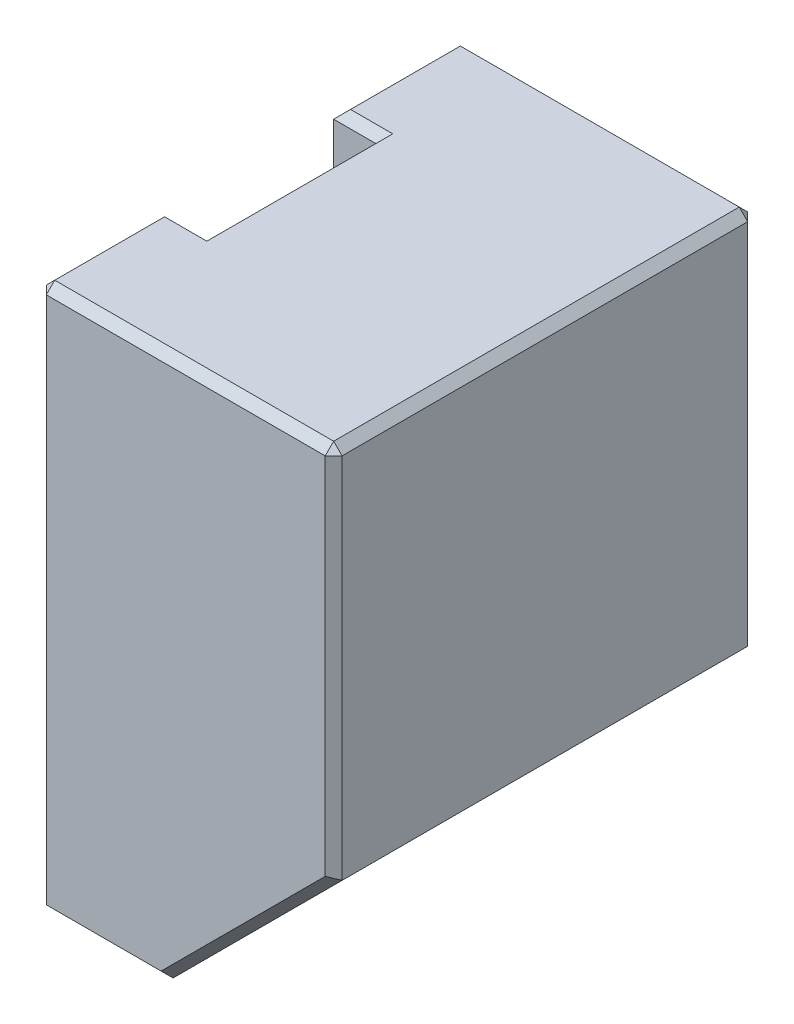
ISO-10303-21;
HEADER;
FILE_DESCRIPTION(('STEP AP214'),'2;1');
FILE_NAME('part.step','',(''),(''),'','','');
FILE_SCHEMA(('AUTOMOTIVE_DESIGN { 1 0 10303 214 1 1 1 1 }'));
ENDSEC;
DATA;
#1=APPLICATION_CONTEXT('core data for automotive mechanical design processes');
#2=APPLICATION_PROTOCOL_DEFINITION('international standard','automotive_design',2000,#1);
#3=PRODUCT_CONTEXT('',#1,'mechanical');
#4=PRODUCT('Part','Part','',(#3));
#5=PRODUCT_RELATED_PRODUCT_CATEGORY('part','',(#4));
#6=PRODUCT_DEFINITION_FORMATION('','',#4);
#7=PRODUCT_DEFINITION_CONTEXT('part definition',#1,'design');
#8=PRODUCT_DEFINITION('design','',#6,#7);
#9=PRODUCT_DEFINITION_SHAPE('','',#8);
#10=(LENGTH_UNIT() NAMED_UNIT(*) SI_UNIT(.MILLI.,.METRE.));
#11=(NAMED_UNIT(*) PLANE_ANGLE_UNIT() SI_UNIT($,.RADIAN.));
#12=(NAMED_UNIT(*) SI_UNIT($,.STERADIAN.) SOLID_ANGLE_UNIT());
#13=UNCERTAINTY_MEASURE_WITH_UNIT(LENGTH_MEASURE(1.E-05),#10,'distance_accuracy_value','');
#14=(GEOMETRIC_REPRESENTATION_CONTEXT(3) GLOBAL_UNCERTAINTY_ASSIGNED_CONTEXT((#13)) GLOBAL_UNIT_ASSIGNED_CONTEXT((#10,
#11,#12)) REPRESENTATION_CONTEXT('',''));
#15=CARTESIAN_POINT('',(0.,0.,0.));
#16=DIRECTION('',(0.,0.,1.));
#17=DIRECTION('',(1.,0.,0.));
#18=AXIS2_PLACEMENT_3D('',#15,#16,#17);
#19=CARTESIAN_POINT('',(-17.5,-40.5,12.5));
#20=DIRECTION('',(-1.,0.,0.));
#21=DIRECTION('',(0.,0.,1.));
#22=AXIS2_PLACEMENT_3D('',#19,#20,#21);
#23=CYLINDRICAL_SURFACE('',#22,2.5);
#24=DIRECTION('',(1.,0.,0.));
#25=VECTOR('',#24,1.);
#26=CARTESIAN_POINT('',(-17.5,-43.,12.5));
#27=LINE('',#26,#25);
#28=CARTESIAN_POINT('',(-17.5,-43.,12.5));
#29=VERTEX_POINT('',#28);
#30=CARTESIAN_POINT('',(-12.5,-43.,12.5));
#31=VERTEX_POINT('',#30);
#32=EDGE_CURVE('E318',#29,#31,#27,.T.);
#33=ORIENTED_EDGE('',*,*,#32,.F.);
#34=CARTESIAN_POINT('',(-17.5,-40.5,12.5));
#35=DIRECTION('',(-1.,0.,0.));
#36=DIRECTION('',(0.,0.,1.));
#37=AXIS2_PLACEMENT_3D('',#34,#35,#36);
#38=CIRCLE('',#37,2.5);
#39=CARTESIAN_POINT('',(-17.5,-38.,12.5));
#40=VERTEX_POINT('',#39);
#41=EDGE_CURVE('E326',#29,#40,#38,.T.);
#42=ORIENTED_EDGE('',*,*,#41,.T.);
#43=DIRECTION('',(1.,0.,0.));
#44=VECTOR('',#43,1.);
#45=CARTESIAN_POINT('',(-17.5,-38.,12.5));
#46=LINE('',#45,#44);
#47=CARTESIAN_POINT('',(-12.5,-38.,12.5));
#48=VERTEX_POINT('',#47);
#49=EDGE_CURVE('E321',#48,#40,#46,.F.);
#50=ORIENTED_EDGE('',*,*,#49,.F.);
#51=CARTESIAN_POINT('',(-12.5,-40.5,12.5));
#52=DIRECTION('',(1.,0.,0.));
#53=DIRECTION('',(0.,0.,-1.));
#54=AXIS2_PLACEMENT_3D('',#51,#52,#53);
#55=CIRCLE('',#54,2.5);
#56=EDGE_CURVE('E324',#31,#48,#55,.F.);
#57=ORIENTED_EDGE('',*,*,#56,.F.);
#58=EDGE_LOOP('',(#33,#42,#50,#57));
#59=FACE_BOUND('',#58,.T.);
#60=ADVANCED_FACE('F47',(#59),#23,.F.);
#61=CARTESIAN_POINT('',(-12.5,-40.5,-12.5));
#62=DIRECTION('',(-1.,0.,0.));
#63=DIRECTION('',(0.,0.,1.));
#64=AXIS2_PLACEMENT_3D('',#61,#62,#63);
#65=CYLINDRICAL_SURFACE('',#64,2.5);
#66=DIRECTION('',(1.,0.,0.));
#67=VECTOR('',#66,1.);
#68=CARTESIAN_POINT('',(-12.5,-43.,-12.5));
#69=LINE('',#68,#67);
#70=CARTESIAN_POINT('',(-12.5,-43.,-12.5));
#71=VERTEX_POINT('',#70);
#72=CARTESIAN_POINT('',(-17.5,-43.,-12.5));
#73=VERTEX_POINT('',#72);
#74=EDGE_CURVE('E309',#71,#73,#69,.F.);
#75=ORIENTED_EDGE('',*,*,#74,.F.);
#76=CARTESIAN_POINT('',(-12.5,-40.5,-12.5));
#77=DIRECTION('',(1.,0.,0.));
#78=DIRECTION('',(0.,0.,-1.));
#79=AXIS2_PLACEMENT_3D('',#76,#77,#78);
#80=CIRCLE('',#79,2.5);
#81=CARTESIAN_POINT('',(-12.5,-38.,-12.5));
#82=VERTEX_POINT('',#81);
#83=EDGE_CURVE('E314',#82,#71,#80,.F.);
#84=ORIENTED_EDGE('',*,*,#83,.F.);
#85=DIRECTION('',(1.,0.,0.));
#86=VECTOR('',#85,1.);
#87=CARTESIAN_POINT('',(-12.5,-38.,-12.5));
#88=LINE('',#87,#86);
#89=CARTESIAN_POINT('',(-17.5,-38.,-12.5));
#90=VERTEX_POINT('',#89);
#91=EDGE_CURVE('E312',#90,#82,#88,.T.);
#92=ORIENTED_EDGE('',*,*,#91,.F.);
#93=CARTESIAN_POINT('',(-17.5,-40.5,-12.5));
#94=DIRECTION('',(-1.,0.,0.));
#95=DIRECTION('',(0.,0.,1.));
#96=AXIS2_PLACEMENT_3D('',#93,#94,#95);
#97=CIRCLE('',#96,2.5);
#98=EDGE_CURVE('E247',#90,#73,#97,.T.);
#99=ORIENTED_EDGE('',*,*,#98,.T.);
#100=EDGE_LOOP('',(#75,#84,#92,#99));
#101=FACE_BOUND('',#100,.T.);
#102=ADVANCED_FACE('F562',(#101),#65,.F.);
#103=CARTESIAN_POINT('',(10.4999999999999,-51.5,0.));
#104=DIRECTION('',(-1.,0.,0.));
#105=DIRECTION('',(0.,0.,1.));
#106=AXIS2_PLACEMENT_3D('',#103,#104,#105);
#107=CYLINDRICAL_SURFACE('',#106,7.);
#108=CARTESIAN_POINT('',(10.4999999999999,-51.5,0.));
#109=DIRECTION('',(-0.707106781186544,0.707106781186551,0.));
#110=DIRECTION('',(-0.707106781186551,-0.707106781186544,0.));
#111=AXIS2_PLACEMENT_3D('',#108,#109,#110);
#112=ELLIPSE('',#111,9.89949493661172,7.);
#113=CARTESIAN_POINT('',(10.4999999999999,-51.5,7.));
#114=VERTEX_POINT('',#113);
#115=CARTESIAN_POINT('',(17.5,-44.5,0.));
#116=VERTEX_POINT('',#115);
#117=EDGE_CURVE('E298',#114,#116,#112,.T.);
#118=ORIENTED_EDGE('',*,*,#117,.F.);
#119=DIRECTION('',(1.,0.,0.));
#120=VECTOR('',#119,1.);
#121=CARTESIAN_POINT('',(10.4999999999999,-51.5,7.));
#122=LINE('',#121,#120);
#123=CARTESIAN_POINT('',(-17.5,-51.5,7.));
#124=VERTEX_POINT('',#123);
#125=EDGE_CURVE('E295',#124,#114,#122,.T.);
#126=ORIENTED_EDGE('',*,*,#125,.F.);
#127=CARTESIAN_POINT('',(-17.5,-51.5,0.));
#128=DIRECTION('',(-1.,0.,0.));
#129=DIRECTION('',(0.,0.,1.));
#130=AXIS2_PLACEMENT_3D('',#127,#128,#129);
#131=CIRCLE('',#130,7.);
#132=CARTESIAN_POINT('',(-17.5,-51.5,-7.));
#133=VERTEX_POINT('',#132);
#134=EDGE_CURVE('E304',#124,#133,#131,.T.);
#135=ORIENTED_EDGE('',*,*,#134,.T.);
#136=DIRECTION('',(1.,0.,0.));
#137=VECTOR('',#136,1.);
#138=CARTESIAN_POINT('',(10.4999999999999,-51.5,-7.));
#139=LINE('',#138,#137);
#140=CARTESIAN_POINT('',(10.4999999999999,-51.5,-7.));
#141=VERTEX_POINT('',#140);
#142=EDGE_CURVE('E292',#141,#133,#139,.F.);
#143=ORIENTED_EDGE('',*,*,#142,.F.);
#144=CARTESIAN_POINT('',(10.4999999999999,-51.5,0.));
#145=DIRECTION('',(-0.707106781186544,0.707106781186551,0.));
#146=DIRECTION('',(-0.707106781186551,-0.707106781186544,0.));
#147=AXIS2_PLACEMENT_3D('',#144,#145,#146);
#148=ELLIPSE('',#147,9.89949493661172,7.);
#149=EDGE_CURVE('E301',#141,#116,#148,.F.);
#150=ORIENTED_EDGE('',*,*,#149,.T.);
#151=EDGE_LOOP('',(#118,#126,#135,#143,#150));
#152=FACE_BOUND('',#151,.T.);
#153=ADVANCED_FACE('F528',(#152),#107,.F.);
#154=CARTESIAN_POINT('',(0.,-64.5,0.));
#155=DIRECTION('',(0.,-1.,0.));
#156=DIRECTION('',(0.,0.,-1.));
#157=AXIS2_PLACEMENT_3D('',#154,#155,#156);
#158=PLANE('',#157);
#159=DIRECTION('',(0.,0.,1.));
#160=VECTOR('',#159,1.);
#161=CARTESIAN_POINT('',(-17.5,-64.5,24.995));
#162=LINE('',#161,#160);
#163=CARTESIAN_POINT('',(-17.5,-64.5,-23.995));
#164=VERTEX_POINT('',#163);
#165=CARTESIAN_POINT('',(-17.5,-64.5,-7.));
#166=VERTEX_POINT('',#165);
#167=EDGE_CURVE('E290',#164,#166,#162,.T.);
#168=ORIENTED_EDGE('',*,*,#167,.F.);
#169=DIRECTION('',(1.,0.,0.));
#170=VECTOR('',#169,1.);
#171=CARTESIAN_POINT('',(0.,-64.5,-23.995));
#172=LINE('',#171,#170);
#173=CARTESIAN_POINT('',(-2.50000000000021,-64.5,-23.995));
#174=VERTEX_POINT('',#173);
#175=EDGE_CURVE('E365',#164,#174,#172,.T.);
#176=ORIENTED_EDGE('',*,*,#175,.T.);
#177=DIRECTION('',(0.,0.,1.));
#178=VECTOR('',#177,1.);
#179=CARTESIAN_POINT('',(-2.50000000000021,-64.5,-24.996));
#180=LINE('',#179,#178);
#181=CARTESIAN_POINT('',(-2.50000000000021,-64.5,-7.00000000000001));
#182=VERTEX_POINT('',#181);
#183=EDGE_CURVE('E284',#174,#182,#180,.T.);
#184=ORIENTED_EDGE('',*,*,#183,.T.);
#185=DIRECTION('',(-1.,0.,0.));
#186=VECTOR('',#185,1.);
#187=CARTESIAN_POINT('',(17.501,-64.5,-7.));
#188=LINE('',#187,#186);
#189=EDGE_CURVE('E278',#182,#166,#188,.T.);
#190=ORIENTED_EDGE('',*,*,#189,.T.);
#191=EDGE_LOOP('',(#168,#176,#184,#190));
#192=FACE_BOUND('',#191,.T.);
#193=ADVANCED_FACE('F514',(#192),#158,.T.);
#194=CARTESIAN_POINT('',(-2.50000000000021,-64.5,-24.996));
#195=DIRECTION('',(-0.707106781186544,0.707106781186551,0.));
#196=DIRECTION('',(-0.707106781186551,-0.707106781186544,0.));
#197=AXIS2_PLACEMENT_3D('',#194,#195,#196);
#198=PLANE('',#197);
#199=ORIENTED_EDGE('',*,*,#183,.F.);
#200=DIRECTION('',(0.707106781186551,0.707106781186544,0.));
#201=VECTOR('',#200,1.);
#202=CARTESIAN_POINT('',(17.5,-44.5,-23.995));
#203=LINE('',#202,#201);
#204=CARTESIAN_POINT('',(17.5,-44.5,-23.995));
#205=VERTEX_POINT('',#204);
#206=EDGE_CURVE('E363',#174,#205,#203,.T.);
#207=ORIENTED_EDGE('',*,*,#206,.T.);
#208=DIRECTION('',(0.,0.,1.));
#209=VECTOR('',#208,1.);
#210=CARTESIAN_POINT('',(17.5,-44.5,-24.996));
#211=LINE('',#210,#209);
#212=EDGE_CURVE('E288',#205,#116,#211,.T.);
#213=ORIENTED_EDGE('',*,*,#212,.T.);
#214=ORIENTED_EDGE('',*,*,#149,.F.);
#215=DIRECTION('',(0.707106781186551,0.707106781186544,0.));
#216=VECTOR('',#215,1.);
#217=CARTESIAN_POINT('',(7.5005,-54.4994999999999,-7.));
#218=LINE('',#217,#216);
#219=EDGE_CURVE('E257',#182,#141,#218,.T.);
#220=ORIENTED_EDGE('',*,*,#219,.F.);
#221=EDGE_LOOP('',(#199,#207,#213,#214,#220));
#222=FACE_BOUND('',#221,.T.);
#223=ADVANCED_FACE('F518',(#222),#198,.F.);
#224=CARTESIAN_POINT('',(17.5,-64.5,24.995));
#225=DIRECTION('',(1.,0.,0.));
#226=DIRECTION('',(0.,0.,-1.));
#227=AXIS2_PLACEMENT_3D('',#224,#225,#226);
#228=PLANE('',#227);
#229=ORIENTED_EDGE('',*,*,#212,.F.);
#230=DIRECTION('',(0.,1.,0.));
#231=VECTOR('',#230,1.);
#232=CARTESIAN_POINT('',(17.5,-64.5,-23.995));
#233=LINE('',#232,#231);
#234=CARTESIAN_POINT('',(17.5,-1.,-23.995));
#235=VERTEX_POINT('',#234);
#236=EDGE_CURVE('E350',#205,#235,#233,.T.);
#237=ORIENTED_EDGE('',*,*,#236,.T.);
#238=DIRECTION('',(0.,0.,1.));
#239=VECTOR('',#238,1.);
#240=CARTESIAN_POINT('',(17.5,-1.,24.995));
#241=LINE('',#240,#239);
#242=CARTESIAN_POINT('',(17.5,-1.,23.995));
#243=VERTEX_POINT('',#242);
#244=EDGE_CURVE('E347',#235,#243,#241,.T.);
#245=ORIENTED_EDGE('',*,*,#244,.T.);
#246=DIRECTION('',(0.,-1.,0.));
#247=VECTOR('',#246,1.);
#248=CARTESIAN_POINT('',(17.5,-64.5,23.995));
#249=LINE('',#248,#247);
#250=CARTESIAN_POINT('',(17.5,-44.5,23.995));
#251=VERTEX_POINT('',#250);
#252=EDGE_CURVE('E345',#243,#251,#249,.T.);
#253=ORIENTED_EDGE('',*,*,#252,.T.);
#254=EDGE_CURVE('E281',#116,#251,#211,.T.);
#255=ORIENTED_EDGE('',*,*,#254,.F.);
#256=EDGE_LOOP('',(#229,#237,#245,#253,#255));
#257=FACE_BOUND('',#256,.T.);
#258=ADVANCED_FACE('F715',(#257),#228,.T.);
#259=CARTESIAN_POINT('',(-17.5,-64.5,24.995));
#260=DIRECTION('',(0.,0.,1.));
#261=DIRECTION('',(1.,0.,0.));
#262=AXIS2_PLACEMENT_3D('',#259,#260,#261);
#263=PLANE('',#262);
#264=DIRECTION('',(0.,-1.,0.));
#265=VECTOR('',#264,1.);
#266=CARTESIAN_POINT('',(-16.5,-64.5,24.995));
#267=LINE('',#266,#265);
#268=CARTESIAN_POINT('',(-16.5,-1.,24.995));
#269=VERTEX_POINT('',#268);
#270=CARTESIAN_POINT('',(-16.5,-63.5,24.995));
#271=VERTEX_POINT('',#270);
#272=EDGE_CURVE('E71',#269,#271,#267,.T.);
#273=ORIENTED_EDGE('',*,*,#272,.T.);
#274=DIRECTION('',(1.,0.,0.));
#275=VECTOR('',#274,1.);
#276=CARTESIAN_POINT('',(-17.5,-63.5,24.995));
#277=LINE('',#276,#275);
#278=CARTESIAN_POINT('',(-2.91421356237332,-63.5,24.995));
#279=VERTEX_POINT('',#278);
#280=EDGE_CURVE('E387',#271,#279,#277,.T.);
#281=ORIENTED_EDGE('',*,*,#280,.T.);
#282=DIRECTION('',(0.707106781186551,0.707106781186544,0.));
#283=VECTOR('',#282,1.);
#284=CARTESIAN_POINT('',(16.7928932188134,-43.7928932188134,24.995));
#285=LINE('',#284,#283);
#286=CARTESIAN_POINT('',(16.5,-44.0857864376269,24.995));
#287=VERTEX_POINT('',#286);
#288=EDGE_CURVE('E380',#279,#287,#285,.T.);
#289=ORIENTED_EDGE('',*,*,#288,.T.);
#290=DIRECTION('',(0.,1.,0.));
#291=VECTOR('',#290,1.);
#292=CARTESIAN_POINT('',(16.5,-64.5,24.995));
#293=LINE('',#292,#291);
#294=CARTESIAN_POINT('',(16.5,-1.,24.995));
#295=VERTEX_POINT('',#294);
#296=EDGE_CURVE('E382',#287,#295,#293,.T.);
#297=ORIENTED_EDGE('',*,*,#296,.T.);
#298=DIRECTION('',(-1.,0.,0.));
#299=VECTOR('',#298,1.);
#300=CARTESIAN_POINT('',(-17.5,-1.,24.995));
#301=LINE('',#300,#299);
#302=EDGE_CURVE('E384',#295,#269,#301,.T.);
#303=ORIENTED_EDGE('',*,*,#302,.T.);
#304=EDGE_LOOP('',(#273,#281,#289,#297,#303));
#305=FACE_BOUND('',#304,.T.);
#306=ADVANCED_FACE('F548',(#305),#263,.T.);
#307=CARTESIAN_POINT('',(-17.5,-64.5,24.995));
#308=DIRECTION('',(-1.,0.,0.));
#309=DIRECTION('',(0.,0.,1.));
#310=AXIS2_PLACEMENT_3D('',#307,#308,#309);
#311=PLANE('',#310);
#312=DIRECTION('',(0.,0.,-1.));
#313=VECTOR('',#312,1.);
#314=CARTESIAN_POINT('',(-17.5,-1.,-24.995));
#315=LINE('',#314,#313);
#316=CARTESIAN_POINT('',(-17.5,-1.,-10.));
#317=VERTEX_POINT('',#316);
#318=CARTESIAN_POINT('',(-17.5,-1.,-23.995));
#319=VERTEX_POINT('',#318);
#320=EDGE_CURVE('E371',#317,#319,#315,.T.);
#321=ORIENTED_EDGE('',*,*,#320,.T.);
#322=DIRECTION('',(0.,-1.,0.));
#323=VECTOR('',#322,1.);
#324=CARTESIAN_POINT('',(-17.5,-64.5,-23.995));
#325=LINE('',#324,#323);
#326=EDGE_CURVE('E373',#319,#164,#325,.T.);
#327=ORIENTED_EDGE('',*,*,#326,.T.);
#328=ORIENTED_EDGE('',*,*,#167,.T.);
#329=DIRECTION('',(0.,-1.,0.));
#330=VECTOR('',#329,1.);
#331=CARTESIAN_POINT('',(-17.5,-64.5,-7.));
#332=LINE('',#331,#330);
#333=EDGE_CURVE('E272',#133,#166,#332,.T.);
#334=ORIENTED_EDGE('',*,*,#333,.F.);
#335=ORIENTED_EDGE('',*,*,#134,.F.);
#336=DIRECTION('',(0.,1.,0.));
#337=VECTOR('',#336,1.);
#338=CARTESIAN_POINT('',(-17.5,-64.5,7.));
#339=LINE('',#338,#337);
#340=CARTESIAN_POINT('',(-17.5,-64.5,7.));
#341=VERTEX_POINT('',#340);
#342=EDGE_CURVE('E275',#341,#124,#339,.T.);
#343=ORIENTED_EDGE('',*,*,#342,.F.);
#344=CARTESIAN_POINT('',(-17.5,-64.5,23.995));
#345=VERTEX_POINT('',#344);
#346=EDGE_CURVE('E286',#341,#345,#162,.T.);
#347=ORIENTED_EDGE('',*,*,#346,.T.);
#348=DIRECTION('',(0.,1.,0.));
#349=VECTOR('',#348,1.);
#350=CARTESIAN_POINT('',(-17.5,-64.5,23.995));
#351=LINE('',#350,#349);
#352=CARTESIAN_POINT('',(-17.5,-1.,23.995));
#353=VERTEX_POINT('',#352);
#354=EDGE_CURVE('E367',#345,#353,#351,.T.);
#355=ORIENTED_EDGE('',*,*,#354,.T.);
#356=DIRECTION('',(0.,0.,-1.));
#357=VECTOR('',#356,1.);
#358=CARTESIAN_POINT('',(-17.5,-1.,10.));
#359=LINE('',#358,#357);
#360=CARTESIAN_POINT('',(-17.5,-1.,10.));
#361=VERTEX_POINT('',#360);
#362=EDGE_CURVE('E369',#353,#361,#359,.T.);
#363=ORIENTED_EDGE('',*,*,#362,.T.);
#364=DIRECTION('',(0.,1.,0.));
#365=VECTOR('',#364,1.);
#366=CARTESIAN_POINT('',(-17.5,-43.,10.));
#367=LINE('',#366,#365);
#368=CARTESIAN_POINT('',(-17.5,-38.,10.));
#369=VERTEX_POINT('',#368);
#370=EDGE_CURVE('E267',#369,#361,#367,.T.);
#371=ORIENTED_EDGE('',*,*,#370,.F.);
#372=DIRECTION('',(0.,0.,-1.));
#373=VECTOR('',#372,1.);
#374=CARTESIAN_POINT('',(-17.5,-38.,-15.));
#375=LINE('',#374,#373);
#376=EDGE_CURVE('E249',#40,#369,#375,.T.);
#377=ORIENTED_EDGE('',*,*,#376,.F.);
#378=ORIENTED_EDGE('',*,*,#41,.F.);
#379=DIRECTION('',(0.,0.,1.));
#380=VECTOR('',#379,1.);
#381=CARTESIAN_POINT('',(-17.5,-43.,10.));
#382=LINE('',#381,#380);
#383=EDGE_CURVE('E238',#73,#29,#382,.T.);
#384=ORIENTED_EDGE('',*,*,#383,.F.);
#385=ORIENTED_EDGE('',*,*,#98,.F.);
#386=CARTESIAN_POINT('',(-17.5,-38.,-10.));
#387=VERTEX_POINT('',#386);
#388=EDGE_CURVE('E231',#387,#90,#375,.T.);
#389=ORIENTED_EDGE('',*,*,#388,.F.);
#390=DIRECTION('',(0.,1.,0.));
#391=VECTOR('',#390,1.);
#392=CARTESIAN_POINT('',(-17.5,-43.,-10.));
#393=LINE('',#392,#391);
#394=EDGE_CURVE('E244',#387,#317,#393,.T.);
#395=ORIENTED_EDGE('',*,*,#394,.T.);
#396=EDGE_LOOP('',(#321,#327,#328,#334,#335,#343,#347,#355,#363,#371,#377,#378,#384,#385,#389,#395));
#397=FACE_BOUND('',#396,.T.);
#398=ADVANCED_FACE('F243',(#397),#311,.T.);
#399=CARTESIAN_POINT('',(-17.5,-64.5,-24.995));
#400=DIRECTION('',(0.,0.,-1.));
#401=DIRECTION('',(-1.,0.,0.));
#402=AXIS2_PLACEMENT_3D('',#399,#400,#401);
#403=PLANE('',#402);
#404=DIRECTION('',(1.,0.,0.));
#405=VECTOR('',#404,1.);
#406=CARTESIAN_POINT('',(17.5,-1.,-24.995));
#407=LINE('',#406,#405);
#408=CARTESIAN_POINT('',(-16.5,-1.,-24.995));
#409=VERTEX_POINT('',#408);
#410=CARTESIAN_POINT('',(16.5,-1.,-24.995));
#411=VERTEX_POINT('',#410);
#412=EDGE_CURVE('E358',#409,#411,#407,.T.);
#413=ORIENTED_EDGE('',*,*,#412,.T.);
#414=DIRECTION('',(0.,-1.,0.));
#415=VECTOR('',#414,1.);
#416=CARTESIAN_POINT('',(16.5,-64.5,-24.995));
#417=LINE('',#416,#415);
#418=CARTESIAN_POINT('',(16.5,-44.0857864376269,-24.995));
#419=VERTEX_POINT('',#418);
#420=EDGE_CURVE('E360',#411,#419,#417,.T.);
#421=ORIENTED_EDGE('',*,*,#420,.T.);
#422=DIRECTION('',(-0.707106781186551,-0.707106781186544,0.));
#423=VECTOR('',#422,1.);
#424=CARTESIAN_POINT('',(-3.20710678118675,-63.7928932188135,-24.995));
#425=LINE('',#424,#423);
#426=CARTESIAN_POINT('',(-2.91421356237329,-63.5,-24.995));
#427=VERTEX_POINT('',#426);
#428=EDGE_CURVE('E356',#419,#427,#425,.T.);
#429=ORIENTED_EDGE('',*,*,#428,.T.);
#430=DIRECTION('',(-1.,0.,0.));
#431=VECTOR('',#430,1.);
#432=CARTESIAN_POINT('',(-17.5,-63.5,-24.995));
#433=LINE('',#432,#431);
#434=CARTESIAN_POINT('',(-16.5,-63.5,-24.995));
#435=VERTEX_POINT('',#434);
#436=EDGE_CURVE('E354',#427,#435,#433,.T.);
#437=ORIENTED_EDGE('',*,*,#436,.T.);
#438=DIRECTION('',(0.,1.,0.));
#439=VECTOR('',#438,1.);
#440=CARTESIAN_POINT('',(-16.5,-64.5,-24.995));
#441=LINE('',#440,#439);
#442=EDGE_CURVE('E352',#435,#409,#441,.T.);
#443=ORIENTED_EDGE('',*,*,#442,.T.);
#444=EDGE_LOOP('',(#413,#421,#429,#437,#443));
#445=FACE_BOUND('',#444,.T.);
#446=ADVANCED_FACE('F710',(#445),#403,.T.);
#447=CARTESIAN_POINT('',(-2.50000000000021,-64.5,7.));
#448=VERTEX_POINT('',#447);
#449=CARTESIAN_POINT('',(-2.50000000000021,-64.5,23.995));
#450=VERTEX_POINT('',#449);
#451=EDGE_CURVE('E287',#448,#450,#180,.T.);
#452=ORIENTED_EDGE('',*,*,#451,.T.);
#453=DIRECTION('',(-1.,0.,0.));
#454=VECTOR('',#453,1.);
#455=CARTESIAN_POINT('',(0.,-64.5,23.995));
#456=LINE('',#455,#454);
#457=EDGE_CURVE('E57',#450,#345,#456,.T.);
#458=ORIENTED_EDGE('',*,*,#457,.T.);
#459=ORIENTED_EDGE('',*,*,#346,.F.);
#460=DIRECTION('',(-1.,0.,0.));
#461=VECTOR('',#460,1.);
#462=CARTESIAN_POINT('',(17.501,-64.5,7.));
#463=LINE('',#462,#461);
#464=EDGE_CURVE('E279',#448,#341,#463,.T.);
#465=ORIENTED_EDGE('',*,*,#464,.F.);
#466=EDGE_LOOP('',(#452,#458,#459,#465));
#467=FACE_BOUND('',#466,.T.);
#468=ADVANCED_FACE('F534',(#467),#158,.T.);
#469=CARTESIAN_POINT('',(0.,0.,0.));
#470=DIRECTION('',(0.,-1.,0.));
#471=DIRECTION('',(0.,0.,-1.));
#472=AXIS2_PLACEMENT_3D('',#469,#470,#471);
#473=PLANE('',#472);
#474=DIRECTION('',(1.,0.,0.));
#475=VECTOR('',#474,1.);
#476=CARTESIAN_POINT('',(17.5,0.,23.995));
#477=LINE('',#476,#475);
#478=CARTESIAN_POINT('',(-16.5,0.,23.995));
#479=VERTEX_POINT('',#478);
#480=CARTESIAN_POINT('',(16.5,0.,23.995));
#481=VERTEX_POINT('',#480);
#482=EDGE_CURVE('E328',#479,#481,#477,.T.);
#483=ORIENTED_EDGE('',*,*,#482,.T.);
#484=DIRECTION('',(0.,0.,-1.));
#485=VECTOR('',#484,1.);
#486=CARTESIAN_POINT('',(16.5,0.,-24.995));
#487=LINE('',#486,#485);
#488=CARTESIAN_POINT('',(16.5,0.,-23.995));
#489=VERTEX_POINT('',#488);
#490=EDGE_CURVE('E342',#481,#489,#487,.T.);
#491=ORIENTED_EDGE('',*,*,#490,.T.);
#492=DIRECTION('',(-1.,0.,0.));
#493=VECTOR('',#492,1.);
#494=CARTESIAN_POINT('',(-17.5,0.,-23.995));
#495=LINE('',#494,#493);
#496=CARTESIAN_POINT('',(-16.5,0.,-23.995));
#497=VERTEX_POINT('',#496);
#498=EDGE_CURVE('E340',#489,#497,#495,.T.);
#499=ORIENTED_EDGE('',*,*,#498,.T.);
#500=DIRECTION('',(0.,0.,1.));
#501=VECTOR('',#500,1.);
#502=CARTESIAN_POINT('',(-16.5,0.,-10.));
#503=LINE('',#502,#501);
#504=CARTESIAN_POINT('',(-16.5,0.,-11.));
#505=VERTEX_POINT('',#504);
#506=EDGE_CURVE('E338',#497,#505,#503,.T.);
#507=ORIENTED_EDGE('',*,*,#506,.T.);
#508=DIRECTION('',(1.,0.,0.));
#509=VECTOR('',#508,1.);
#510=CARTESIAN_POINT('',(0.,0.,-11.));
#511=LINE('',#510,#509);
#512=CARTESIAN_POINT('',(-11.5,0.,-11.));
#513=VERTEX_POINT('',#512);
#514=EDGE_CURVE('E336',#505,#513,#511,.T.);
#515=ORIENTED_EDGE('',*,*,#514,.T.);
#516=DIRECTION('',(0.,0.,1.));
#517=VECTOR('',#516,1.);
#518=CARTESIAN_POINT('',(-11.5,0.,0.));
#519=LINE('',#518,#517);
#520=CARTESIAN_POINT('',(-11.5,0.,11.));
#521=VERTEX_POINT('',#520);
#522=EDGE_CURVE('E334',#513,#521,#519,.T.);
#523=ORIENTED_EDGE('',*,*,#522,.T.);
#524=DIRECTION('',(-1.,0.,0.));
#525=VECTOR('',#524,1.);
#526=CARTESIAN_POINT('',(0.,0.,11.));
#527=LINE('',#526,#525);
#528=CARTESIAN_POINT('',(-16.5,0.,11.));
#529=VERTEX_POINT('',#528);
#530=EDGE_CURVE('E332',#521,#529,#527,.T.);
#531=ORIENTED_EDGE('',*,*,#530,.T.);
#532=DIRECTION('',(0.,0.,1.));
#533=VECTOR('',#532,1.);
#534=CARTESIAN_POINT('',(-16.5,0.,24.995));
#535=LINE('',#534,#533);
#536=EDGE_CURVE('E330',#529,#479,#535,.T.);
#537=ORIENTED_EDGE('',*,*,#536,.T.);
#538=EDGE_LOOP('',(#483,#491,#499,#507,#515,#523,#531,#537));
#539=FACE_BOUND('',#538,.T.);
#540=ADVANCED_FACE('F490',(#539),#473,.F.);
#541=ORIENTED_EDGE('',*,*,#254,.T.);
#542=DIRECTION('',(-0.707106781186551,-0.707106781186544,0.));
#543=VECTOR('',#542,1.);
#544=CARTESIAN_POINT('',(-2.50000000000021,-64.5,23.995));
#545=LINE('',#544,#543);
#546=EDGE_CURVE('E12',#251,#450,#545,.T.);
#547=ORIENTED_EDGE('',*,*,#546,.T.);
#548=ORIENTED_EDGE('',*,*,#451,.F.);
#549=DIRECTION('',(-0.707106781186551,-0.707106781186544,0.));
#550=VECTOR('',#549,1.);
#551=CARTESIAN_POINT('',(7.5005,-54.4994999999999,7.));
#552=LINE('',#551,#550);
#553=EDGE_CURVE('E254',#114,#448,#552,.T.);
#554=ORIENTED_EDGE('',*,*,#553,.F.);
#555=ORIENTED_EDGE('',*,*,#117,.T.);
#556=EDGE_LOOP('',(#541,#547,#548,#554,#555));
#557=FACE_BOUND('',#556,.T.);
#558=ADVANCED_FACE('F536',(#557),#198,.F.);
#559=CARTESIAN_POINT('',(17.501,-64.5,-7.));
#560=DIRECTION('',(0.,0.,-1.));
#561=DIRECTION('',(0.,1.,0.));
#562=AXIS2_PLACEMENT_3D('',#559,#560,#561);
#563=PLANE('',#562);
#564=ORIENTED_EDGE('',*,*,#219,.T.);
#565=ORIENTED_EDGE('',*,*,#142,.T.);
#566=ORIENTED_EDGE('',*,*,#333,.T.);
#567=ORIENTED_EDGE('',*,*,#189,.F.);
#568=EDGE_LOOP('',(#564,#565,#566,#567));
#569=FACE_BOUND('',#568,.T.);
#570=ADVANCED_FACE('F522',(#569),#563,.F.);
#571=CARTESIAN_POINT('',(17.501,-64.5,7.));
#572=DIRECTION('',(0.,0.,1.));
#573=DIRECTION('',(0.,-1.,0.));
#574=AXIS2_PLACEMENT_3D('',#571,#572,#573);
#575=PLANE('',#574);
#576=ORIENTED_EDGE('',*,*,#342,.T.);
#577=ORIENTED_EDGE('',*,*,#125,.T.);
#578=ORIENTED_EDGE('',*,*,#553,.T.);
#579=ORIENTED_EDGE('',*,*,#464,.T.);
#580=EDGE_LOOP('',(#576,#577,#578,#579));
#581=FACE_BOUND('',#580,.T.);
#582=ADVANCED_FACE('F531',(#581),#575,.F.);
#583=CARTESIAN_POINT('',(-17.5,-43.,-10.));
#584=DIRECTION('',(0.,0.,-1.));
#585=DIRECTION('',(-1.,0.,0.));
#586=AXIS2_PLACEMENT_3D('',#583,#584,#585);
#587=PLANE('',#586);
#588=DIRECTION('',(0.,1.,0.));
#589=VECTOR('',#588,1.);
#590=CARTESIAN_POINT('',(-12.5,-43.,-10.));
#591=LINE('',#590,#589);
#592=CARTESIAN_POINT('',(-12.5,-38.,-10.));
#593=VERTEX_POINT('',#592);
#594=CARTESIAN_POINT('',(-12.5,-1.,-10.));
#595=VERTEX_POINT('',#594);
#596=EDGE_CURVE('E255',#593,#595,#591,.T.);
#597=ORIENTED_EDGE('',*,*,#596,.T.);
#598=DIRECTION('',(-1.,0.,0.));
#599=VECTOR('',#598,1.);
#600=CARTESIAN_POINT('',(-17.5,-1.,-10.));
#601=LINE('',#600,#599);
#602=EDGE_CURVE('E253',#595,#317,#601,.T.);
#603=ORIENTED_EDGE('',*,*,#602,.T.);
#604=ORIENTED_EDGE('',*,*,#394,.F.);
#605=DIRECTION('',(1.,0.,0.));
#606=VECTOR('',#605,1.);
#607=CARTESIAN_POINT('',(-17.5,-38.,-10.));
#608=LINE('',#607,#606);
#609=EDGE_CURVE('E227',#387,#593,#608,.T.);
#610=ORIENTED_EDGE('',*,*,#609,.T.);
#611=EDGE_LOOP('',(#597,#603,#604,#610));
#612=FACE_BOUND('',#611,.T.);
#613=ADVANCED_FACE('F251',(#612),#587,.F.);
#614=CARTESIAN_POINT('',(-12.5,-43.,10.));
#615=DIRECTION('',(1.,0.,0.));
#616=DIRECTION('',(0.,0.,-1.));
#617=AXIS2_PLACEMENT_3D('',#614,#615,#616);
#618=PLANE('',#617);
#619=DIRECTION('',(0.,1.,0.));
#620=VECTOR('',#619,1.);
#621=CARTESIAN_POINT('',(-12.5,-43.,10.));
#622=LINE('',#621,#620);
#623=CARTESIAN_POINT('',(-12.5,-38.,10.));
#624=VERTEX_POINT('',#623);
#625=CARTESIAN_POINT('',(-12.5,-1.,10.));
#626=VERTEX_POINT('',#625);
#627=EDGE_CURVE('E259',#624,#626,#622,.T.);
#628=ORIENTED_EDGE('',*,*,#627,.T.);
#629=DIRECTION('',(0.,0.,-1.));
#630=VECTOR('',#629,1.);
#631=CARTESIAN_POINT('',(-12.5,-1.,10.));
#632=LINE('',#631,#630);
#633=EDGE_CURVE('E376',#626,#595,#632,.T.);
#634=ORIENTED_EDGE('',*,*,#633,.T.);
#635=ORIENTED_EDGE('',*,*,#596,.F.);
#636=DIRECTION('',(0.,0.,-1.));
#637=VECTOR('',#636,1.);
#638=CARTESIAN_POINT('',(-12.5,-38.,-15.));
#639=LINE('',#638,#637);
#640=EDGE_CURVE('E233',#593,#82,#639,.T.);
#641=ORIENTED_EDGE('',*,*,#640,.T.);
#642=ORIENTED_EDGE('',*,*,#83,.T.);
#643=DIRECTION('',(0.,0.,-1.));
#644=VECTOR('',#643,1.);
#645=CARTESIAN_POINT('',(-12.5,-43.,10.));
#646=LINE('',#645,#644);
#647=EDGE_CURVE('E262',#31,#71,#646,.T.);
#648=ORIENTED_EDGE('',*,*,#647,.F.);
#649=ORIENTED_EDGE('',*,*,#56,.T.);
#650=EDGE_CURVE('E239',#48,#624,#639,.T.);
#651=ORIENTED_EDGE('',*,*,#650,.T.);
#652=EDGE_LOOP('',(#628,#634,#635,#641,#642,#648,#649,#651));
#653=FACE_BOUND('',#652,.T.);
#654=ADVANCED_FACE('F462',(#653),#618,.F.);
#655=CARTESIAN_POINT('',(-17.5,-43.,10.));
#656=DIRECTION('',(0.,0.,1.));
#657=DIRECTION('',(1.,0.,0.));
#658=AXIS2_PLACEMENT_3D('',#655,#656,#657);
#659=PLANE('',#658);
#660=ORIENTED_EDGE('',*,*,#370,.T.);
#661=DIRECTION('',(1.,0.,0.));
#662=VECTOR('',#661,1.);
#663=CARTESIAN_POINT('',(-17.5,-1.,10.));
#664=LINE('',#663,#662);
#665=EDGE_CURVE('E378',#361,#626,#664,.T.);
#666=ORIENTED_EDGE('',*,*,#665,.T.);
#667=ORIENTED_EDGE('',*,*,#627,.F.);
#668=DIRECTION('',(-1.,0.,0.));
#669=VECTOR('',#668,1.);
#670=CARTESIAN_POINT('',(-17.5,-38.,10.));
#671=LINE('',#670,#669);
#672=EDGE_CURVE('E306',#624,#369,#671,.T.);
#673=ORIENTED_EDGE('',*,*,#672,.T.);
#674=EDGE_LOOP('',(#660,#666,#667,#673));
#675=FACE_BOUND('',#674,.T.);
#676=ADVANCED_FACE('F467',(#675),#659,.F.);
#677=CARTESIAN_POINT('',(0.,-43.,0.));
#678=DIRECTION('',(0.,-1.,0.));
#679=DIRECTION('',(0.,0.,-1.));
#680=AXIS2_PLACEMENT_3D('',#677,#678,#679);
#681=PLANE('',#680);
#682=ORIENTED_EDGE('',*,*,#383,.T.);
#683=ORIENTED_EDGE('',*,*,#32,.T.);
#684=ORIENTED_EDGE('',*,*,#647,.T.);
#685=ORIENTED_EDGE('',*,*,#74,.T.);
#686=EDGE_LOOP('',(#682,#683,#684,#685));
#687=FACE_BOUND('',#686,.T.);
#688=ADVANCED_FACE('F692',(#687),#681,.F.);
#689=CARTESIAN_POINT('',(17.9138126514911,-38.,-15.));
#690=DIRECTION('',(0.,1.,0.));
#691=DIRECTION('',(0.,0.,1.));
#692=AXIS2_PLACEMENT_3D('',#689,#690,#691);
#693=PLANE('',#692);
#694=ORIENTED_EDGE('',*,*,#650,.F.);
#695=ORIENTED_EDGE('',*,*,#49,.T.);
#696=ORIENTED_EDGE('',*,*,#376,.T.);
#697=ORIENTED_EDGE('',*,*,#672,.F.);
#698=EDGE_LOOP('',(#694,#695,#696,#697));
#699=FACE_BOUND('',#698,.T.);
#700=ADVANCED_FACE('F687',(#699),#693,.F.);
#701=ORIENTED_EDGE('',*,*,#388,.T.);
#702=ORIENTED_EDGE('',*,*,#91,.T.);
#703=ORIENTED_EDGE('',*,*,#640,.F.);
#704=ORIENTED_EDGE('',*,*,#609,.F.);
#705=EDGE_LOOP('',(#701,#702,#703,#704));
#706=FACE_BOUND('',#705,.T.);
#707=ADVANCED_FACE('F229',(#706),#693,.F.);
#708=CARTESIAN_POINT('',(-12.5,-1.,10.));
#709=DIRECTION('',(0.707106781186545,-0.70710678118655,0.));
#710=DIRECTION('',(0.,0.,-1.));
#711=AXIS2_PLACEMENT_3D('',#708,#709,#710);
#712=PLANE('',#711);
#713=DIRECTION('',(-0.577350269189627,-0.577350269189623,0.577350269189628));
#714=VECTOR('',#713,1.);
#715=CARTESIAN_POINT('',(-14.1666666666667,-2.66666666666666,-8.33333333333333));
#716=LINE('',#715,#714);
#717=EDGE_CURVE('E446',#595,#513,#716,.F.);
#718=ORIENTED_EDGE('',*,*,#717,.F.);
#719=ORIENTED_EDGE('',*,*,#633,.F.);
#720=DIRECTION('',(-0.577350269189627,-0.577350269189623,-0.577350269189627));
#721=VECTOR('',#720,1.);
#722=CARTESIAN_POINT('',(-12.5,-1.,10.));
#723=LINE('',#722,#721);
#724=EDGE_CURVE('E52',#521,#626,#723,.T.);
#725=ORIENTED_EDGE('',*,*,#724,.F.);
#726=ORIENTED_EDGE('',*,*,#522,.F.);
#727=EDGE_LOOP('',(#718,#719,#725,#726));
#728=FACE_BOUND('',#727,.T.);
#729=ADVANCED_FACE('F50',(#728),#712,.F.);
#730=CARTESIAN_POINT('',(-17.5,-1.,10.));
#731=DIRECTION('',(0.,-0.70710678118655,0.707106781186545));
#732=DIRECTION('',(1.,0.,0.));
#733=AXIS2_PLACEMENT_3D('',#730,#731,#732);
#734=PLANE('',#733);
#735=ORIENTED_EDGE('',*,*,#724,.T.);
#736=ORIENTED_EDGE('',*,*,#665,.F.);
#737=DIRECTION('',(0.577350269189624,0.577350269189624,0.577350269189629));
#738=VECTOR('',#737,1.);
#739=CARTESIAN_POINT('',(-20.1666666666667,-3.66666666666668,7.3333333333333));
#740=LINE('',#739,#738);
#741=EDGE_CURVE('E441',#529,#361,#740,.F.);
#742=ORIENTED_EDGE('',*,*,#741,.F.);
#743=ORIENTED_EDGE('',*,*,#530,.F.);
#744=EDGE_LOOP('',(#735,#736,#742,#743));
#745=FACE_BOUND('',#744,.T.);
#746=ADVANCED_FACE('F456',(#745),#734,.F.);
#747=CARTESIAN_POINT('',(-17.5,-1.,-10.));
#748=DIRECTION('',(0.,-0.70710678118655,-0.707106781186545));
#749=DIRECTION('',(-1.,0.,0.));
#750=AXIS2_PLACEMENT_3D('',#747,#748,#749);
#751=PLANE('',#750);
#752=ORIENTED_EDGE('',*,*,#717,.T.);
#753=ORIENTED_EDGE('',*,*,#514,.F.);
#754=DIRECTION('',(0.577350269189624,0.577350269189624,-0.577350269189629));
#755=VECTOR('',#754,1.);
#756=CARTESIAN_POINT('',(-17.5,-1.,-9.99999999999999));
#757=LINE('',#756,#755);
#758=EDGE_CURVE('E438',#317,#505,#757,.T.);
#759=ORIENTED_EDGE('',*,*,#758,.F.);
#760=ORIENTED_EDGE('',*,*,#602,.F.);
#761=EDGE_LOOP('',(#752,#753,#759,#760));
#762=FACE_BOUND('',#761,.T.);
#763=ADVANCED_FACE('F493',(#762),#751,.F.);
#764=CARTESIAN_POINT('',(-17.5,-63.5,24.995));
#765=DIRECTION('',(0.,0.707106781186547,-0.707106781186547));
#766=DIRECTION('',(1.,0.,0.));
#767=AXIS2_PLACEMENT_3D('',#764,#765,#766);
#768=PLANE('',#767);
#769=DIRECTION('',(-0.281084637714826,0.678598344545846,0.678598344545846));
#770=VECTOR('',#769,1.);
#771=CARTESIAN_POINT('',(-2.50000000000021,-64.5,23.995));
#772=LINE('',#771,#770);
#773=EDGE_CURVE('E432',#279,#450,#772,.F.);
#774=ORIENTED_EDGE('',*,*,#773,.F.);
#775=ORIENTED_EDGE('',*,*,#280,.F.);
#776=DIRECTION('',(0.577350269189628,0.577350269189625,0.577350269189625));
#777=VECTOR('',#776,1.);
#778=CARTESIAN_POINT('',(-17.5,-64.5,23.995));
#779=LINE('',#778,#777);
#780=EDGE_CURVE('E444',#345,#271,#779,.T.);
#781=ORIENTED_EDGE('',*,*,#780,.F.);
#782=ORIENTED_EDGE('',*,*,#457,.F.);
#783=EDGE_LOOP('',(#774,#775,#781,#782));
#784=FACE_BOUND('',#783,.T.);
#785=ADVANCED_FACE('F550',(#784),#768,.F.);
#786=CARTESIAN_POINT('',(-17.5,-64.5,23.995));
#787=DIRECTION('',(0.707106781186545,0.,-0.70710678118655));
#788=DIRECTION('',(0.,1.,0.));
#789=AXIS2_PLACEMENT_3D('',#786,#787,#788);
#790=PLANE('',#789);
#791=ORIENTED_EDGE('',*,*,#780,.T.);
#792=ORIENTED_EDGE('',*,*,#272,.F.);
#793=DIRECTION('',(-0.70710678118655,0.,-0.707106781186545));
#794=VECTOR('',#793,1.);
#795=CARTESIAN_POINT('',(-17.,-1.,24.495));
#796=LINE('',#795,#794);
#797=EDGE_CURVE('E429',#353,#269,#796,.F.);
#798=ORIENTED_EDGE('',*,*,#797,.F.);
#799=ORIENTED_EDGE('',*,*,#354,.F.);
#800=EDGE_LOOP('',(#791,#792,#798,#799));
#801=FACE_BOUND('',#800,.T.);
#802=ADVANCED_FACE('F480',(#801),#790,.F.);
#803=CARTESIAN_POINT('',(-16.5,0.,0.));
#804=DIRECTION('',(-0.707106781186547,0.707106781186547,0.));
#805=DIRECTION('',(0.,0.,-1.));
#806=AXIS2_PLACEMENT_3D('',#803,#804,#805);
#807=PLANE('',#806);
#808=ORIENTED_EDGE('',*,*,#741,.T.);
#809=ORIENTED_EDGE('',*,*,#362,.F.);
#810=DIRECTION('',(-0.707106781186548,-0.707106781186548,0.));
#811=VECTOR('',#810,1.);
#812=CARTESIAN_POINT('',(-16.5,0.,23.995));
#813=LINE('',#812,#811);
#814=EDGE_CURVE('E426',#479,#353,#813,.T.);
#815=ORIENTED_EDGE('',*,*,#814,.F.);
#816=ORIENTED_EDGE('',*,*,#536,.F.);
#817=EDGE_LOOP('',(#808,#809,#815,#816));
#818=FACE_BOUND('',#817,.T.);
#819=ADVANCED_FACE('F476',(#818),#807,.T.);
#820=CARTESIAN_POINT('',(-16.5,0.,0.));
#821=DIRECTION('',(-0.707106781186547,0.707106781186547,0.));
#822=DIRECTION('',(0.,0.,-1.));
#823=AXIS2_PLACEMENT_3D('',#820,#821,#822);
#824=PLANE('',#823);
#825=ORIENTED_EDGE('',*,*,#758,.T.);
#826=ORIENTED_EDGE('',*,*,#506,.F.);
#827=DIRECTION('',(0.707106781186547,0.707106781186547,0.));
#828=VECTOR('',#827,1.);
#829=CARTESIAN_POINT('',(-16.5,0.,-23.995));
#830=LINE('',#829,#828);
#831=EDGE_CURVE('E423',#319,#497,#830,.T.);
#832=ORIENTED_EDGE('',*,*,#831,.F.);
#833=ORIENTED_EDGE('',*,*,#320,.F.);
#834=EDGE_LOOP('',(#825,#826,#832,#833));
#835=FACE_BOUND('',#834,.T.);
#836=ADVANCED_FACE('F496',(#835),#824,.T.);
#837=CARTESIAN_POINT('',(-16.5,-64.5,-24.995));
#838=DIRECTION('',(0.70710678118655,0.,0.707106781186545));
#839=DIRECTION('',(0.,1.,0.));
#840=AXIS2_PLACEMENT_3D('',#837,#838,#839);
#841=PLANE('',#840);
#842=DIRECTION('',(0.707106781186545,0.,-0.70710678118655));
#843=VECTOR('',#842,1.);
#844=CARTESIAN_POINT('',(-17.,-1.,-24.495));
#845=LINE('',#844,#843);
#846=EDGE_CURVE('E420',#409,#319,#845,.F.);
#847=ORIENTED_EDGE('',*,*,#846,.F.);
#848=ORIENTED_EDGE('',*,*,#442,.F.);
#849=DIRECTION('',(-0.577350269189624,-0.577350269189624,0.577350269189628));
#850=VECTOR('',#849,1.);
#851=CARTESIAN_POINT('',(-16.8333333333333,-63.8333333333333,-24.6616666666667));
#852=LINE('',#851,#850);
#853=EDGE_CURVE('E435',#164,#435,#852,.F.);
#854=ORIENTED_EDGE('',*,*,#853,.F.);
#855=ORIENTED_EDGE('',*,*,#326,.F.);
#856=EDGE_LOOP('',(#847,#848,#854,#855));
#857=FACE_BOUND('',#856,.T.);
#858=ADVANCED_FACE('F503',(#857),#841,.F.);
#859=CARTESIAN_POINT('',(-17.5,-63.5,-24.995));
#860=DIRECTION('',(0.,0.70710678118655,0.707106781186545));
#861=DIRECTION('',(-1.,0.,0.));
#862=AXIS2_PLACEMENT_3D('',#859,#860,#861);
#863=PLANE('',#862);
#864=ORIENTED_EDGE('',*,*,#853,.T.);
#865=ORIENTED_EDGE('',*,*,#436,.F.);
#866=DIRECTION('',(-0.281084637714811,0.678598344545847,-0.678598344545851));
#867=VECTOR('',#866,1.);
#868=CARTESIAN_POINT('',(-4.06661574305027,-60.7178550261012,-27.7771449738988));
#869=LINE('',#868,#867);
#870=EDGE_CURVE('E417',#174,#427,#869,.T.);
#871=ORIENTED_EDGE('',*,*,#870,.F.);
#872=ORIENTED_EDGE('',*,*,#175,.F.);
#873=EDGE_LOOP('',(#864,#865,#871,#872));
#874=FACE_BOUND('',#873,.T.);
#875=ADVANCED_FACE('F510',(#874),#863,.F.);
#876=CARTESIAN_POINT('',(-2.50000000000021,-64.5,23.995));
#877=DIRECTION('',(0.499999999999995,-0.5,0.707106781186551));
#878=DIRECTION('',(0.707106781186551,0.707106781186544,0.));
#879=AXIS2_PLACEMENT_3D('',#876,#877,#878);
#880=PLANE('',#879);
#881=ORIENTED_EDGE('',*,*,#773,.T.);
#882=ORIENTED_EDGE('',*,*,#546,.F.);
#883=DIRECTION('',(0.678598344545849,-0.281084637714825,-0.678598344545844));
#884=VECTOR('',#883,1.);
#885=CARTESIAN_POINT('',(12.1049571322036,-42.2653000745744,29.3900428677964));
#886=LINE('',#885,#884);
#887=EDGE_CURVE('E414',#287,#251,#886,.T.);
#888=ORIENTED_EDGE('',*,*,#887,.F.);
#889=ORIENTED_EDGE('',*,*,#288,.F.);
#890=EDGE_LOOP('',(#881,#882,#888,#889));
#891=FACE_BOUND('',#890,.T.);
#892=ADVANCED_FACE('F541',(#891),#880,.T.);
#893=CARTESIAN_POINT('',(-16.5,0.,23.995));
#894=DIRECTION('',(-0.577350269189624,0.577350269189624,0.577350269189629));
#895=DIRECTION('',(0.70710678118655,0.,0.707106781186545));
#896=AXIS2_PLACEMENT_3D('',#893,#894,#895);
#897=PLANE('',#896);
#898=ORIENTED_EDGE('',*,*,#814,.T.);
#899=ORIENTED_EDGE('',*,*,#797,.T.);
#900=DIRECTION('',(0.,0.707106781186547,-0.707106781186547));
#901=VECTOR('',#900,1.);
#902=CARTESIAN_POINT('',(-16.5,0.,23.995));
#903=LINE('',#902,#901);
#904=EDGE_CURVE('E411',#479,#269,#903,.F.);
#905=ORIENTED_EDGE('',*,*,#904,.F.);
#906=EDGE_LOOP('',(#898,#899,#905));
#907=FACE_BOUND('',#906,.T.);
#908=ADVANCED_FACE('F482',(#907),#897,.T.);
#909=CARTESIAN_POINT('',(-16.5,0.,-23.995));
#910=DIRECTION('',(-0.577350269189629,0.577350269189624,-0.577350269189624));
#911=DIRECTION('',(-0.707106781186545,0.,0.70710678118655));
#912=AXIS2_PLACEMENT_3D('',#909,#910,#911);
#913=PLANE('',#912);
#914=ORIENTED_EDGE('',*,*,#846,.T.);
#915=ORIENTED_EDGE('',*,*,#831,.T.);
#916=DIRECTION('',(0.,-0.707106781186548,-0.707106781186548));
#917=VECTOR('',#916,1.);
#918=CARTESIAN_POINT('',(-16.5,0.,-23.995));
#919=LINE('',#918,#917);
#920=EDGE_CURVE('E408',#409,#497,#919,.F.);
#921=ORIENTED_EDGE('',*,*,#920,.F.);
#922=EDGE_LOOP('',(#914,#915,#921));
#923=FACE_BOUND('',#922,.T.);
#924=ADVANCED_FACE('F631',(#923),#913,.T.);
#925=CARTESIAN_POINT('',(-10.7071067811867,-71.2928932188133,-24.995));
#926=DIRECTION('',(0.500000000000001,-0.500000000000006,-0.707106781186542));
#927=DIRECTION('',(0.707106781186551,0.707106781186544,0.));
#928=AXIS2_PLACEMENT_3D('',#925,#926,#927);
#929=PLANE('',#928);
#930=ORIENTED_EDGE('',*,*,#870,.T.);
#931=ORIENTED_EDGE('',*,*,#428,.F.);
#932=DIRECTION('',(-0.678598344545853,0.281084637714804,-0.678598344545848));
#933=VECTOR('',#932,1.);
#934=CARTESIAN_POINT('',(9.16082463033871,-41.0458004628788,-32.3341753696612));
#935=LINE('',#934,#933);
#936=EDGE_CURVE('E406',#205,#419,#935,.T.);
#937=ORIENTED_EDGE('',*,*,#936,.F.);
#938=ORIENTED_EDGE('',*,*,#206,.F.);
#939=EDGE_LOOP('',(#930,#931,#937,#938));
#940=FACE_BOUND('',#939,.T.);
#941=ADVANCED_FACE('F625',(#940),#929,.T.);
#942=CARTESIAN_POINT('',(16.5,-64.5,24.995));
#943=DIRECTION('',(-0.707106781186545,0.,-0.70710678118655));
#944=DIRECTION('',(0.,1.,0.));
#945=AXIS2_PLACEMENT_3D('',#942,#943,#944);
#946=PLANE('',#945);
#947=ORIENTED_EDGE('',*,*,#887,.T.);
#948=ORIENTED_EDGE('',*,*,#252,.F.);
#949=DIRECTION('',(-0.70710678118655,0.,0.707106781186545));
#950=VECTOR('',#949,1.);
#951=CARTESIAN_POINT('',(17.5,-1.,23.995));
#952=LINE('',#951,#950);
#953=EDGE_CURVE('E403',#295,#243,#952,.F.);
#954=ORIENTED_EDGE('',*,*,#953,.F.);
#955=ORIENTED_EDGE('',*,*,#296,.F.);
#956=EDGE_LOOP('',(#947,#948,#954,#955));
#957=FACE_BOUND('',#956,.T.);
#958=ADVANCED_FACE('F546',(#957),#946,.F.);
#959=CARTESIAN_POINT('',(0.,0.,23.995));
#960=DIRECTION('',(0.,0.707106781186547,0.707106781186547));
#961=DIRECTION('',(-1.,0.,0.));
#962=AXIS2_PLACEMENT_3D('',#959,#960,#961);
#963=PLANE('',#962);
#964=ORIENTED_EDGE('',*,*,#904,.T.);
#965=ORIENTED_EDGE('',*,*,#302,.F.);
#966=DIRECTION('',(0.,-0.707106781186547,0.707106781186547));
#967=VECTOR('',#966,1.);
#968=CARTESIAN_POINT('',(16.5,-0.499999999999997,24.495));
#969=LINE('',#968,#967);
#970=EDGE_CURVE('E400',#481,#295,#969,.T.);
#971=ORIENTED_EDGE('',*,*,#970,.F.);
#972=ORIENTED_EDGE('',*,*,#482,.F.);
#973=EDGE_LOOP('',(#964,#965,#971,#972));
#974=FACE_BOUND('',#973,.T.);
#975=ADVANCED_FACE('F487',(#974),#963,.T.);
#976=CARTESIAN_POINT('',(0.,0.,-23.995));
#977=DIRECTION('',(0.,0.707106781186547,-0.707106781186547));
#978=DIRECTION('',(1.,0.,0.));
#979=AXIS2_PLACEMENT_3D('',#976,#977,#978);
#980=PLANE('',#979);
#981=ORIENTED_EDGE('',*,*,#920,.T.);
#982=ORIENTED_EDGE('',*,*,#498,.F.);
#983=DIRECTION('',(0.,0.707106781186547,0.707106781186547));
#984=VECTOR('',#983,1.);
#985=CARTESIAN_POINT('',(16.5,0.,-23.995));
#986=LINE('',#985,#984);
#987=EDGE_CURVE('E397',#411,#489,#986,.T.);
#988=ORIENTED_EDGE('',*,*,#987,.F.);
#989=ORIENTED_EDGE('',*,*,#412,.F.);
#990=EDGE_LOOP('',(#981,#982,#988,#989));
#991=FACE_BOUND('',#990,.T.);
#992=ADVANCED_FACE('F607',(#991),#980,.T.);
#993=CARTESIAN_POINT('',(17.5,-64.5,-23.995));
#994=DIRECTION('',(-0.707106781186545,0.,0.70710678118655));
#995=DIRECTION('',(0.,1.,0.));
#996=AXIS2_PLACEMENT_3D('',#993,#994,#995);
#997=PLANE('',#996);
#998=ORIENTED_EDGE('',*,*,#936,.T.);
#999=ORIENTED_EDGE('',*,*,#420,.F.);
#1000=DIRECTION('',(0.70710678118655,0.,0.707106781186545));
#1001=VECTOR('',#1000,1.);
#1002=CARTESIAN_POINT('',(17.,-1.,-24.495));
#1003=LINE('',#1002,#1001);
#1004=EDGE_CURVE('E394',#235,#411,#1003,.F.);
#1005=ORIENTED_EDGE('',*,*,#1004,.F.);
#1006=ORIENTED_EDGE('',*,*,#236,.F.);
#1007=EDGE_LOOP('',(#998,#999,#1005,#1006));
#1008=FACE_BOUND('',#1007,.T.);
#1009=ADVANCED_FACE('F600',(#1008),#997,.F.);
#1010=CARTESIAN_POINT('',(17.5,-1.,23.995));
#1011=DIRECTION('',(0.577350269189624,0.577350269189624,0.577350269189628));
#1012=DIRECTION('',(0.70710678118655,0.,-0.707106781186545));
#1013=AXIS2_PLACEMENT_3D('',#1010,#1011,#1012);
#1014=PLANE('',#1013);
#1015=ORIENTED_EDGE('',*,*,#970,.T.);
#1016=ORIENTED_EDGE('',*,*,#953,.T.);
#1017=DIRECTION('',(-0.707106781186548,0.707106781186548,0.));
#1018=VECTOR('',#1017,1.);
#1019=CARTESIAN_POINT('',(17.5,-1.,23.995));
#1020=LINE('',#1019,#1018);
#1021=EDGE_CURVE('E392',#481,#243,#1020,.F.);
#1022=ORIENTED_EDGE('',*,*,#1021,.F.);
#1023=EDGE_LOOP('',(#1015,#1016,#1022));
#1024=FACE_BOUND('',#1023,.T.);
#1025=ADVANCED_FACE('F593',(#1024),#1014,.T.);
#1026=CARTESIAN_POINT('',(16.5,0.,-23.995));
#1027=DIRECTION('',(0.577350269189624,0.577350269189624,-0.577350269189629));
#1028=DIRECTION('',(-0.70710678118655,0.,-0.707106781186545));
#1029=AXIS2_PLACEMENT_3D('',#1026,#1027,#1028);
#1030=PLANE('',#1029);
#1031=ORIENTED_EDGE('',*,*,#1004,.T.);
#1032=ORIENTED_EDGE('',*,*,#987,.T.);
#1033=DIRECTION('',(0.707106781186548,-0.707106781186548,0.));
#1034=VECTOR('',#1033,1.);
#1035=CARTESIAN_POINT('',(16.5,0.,-23.995));
#1036=LINE('',#1035,#1034);
#1037=EDGE_CURVE('E390',#235,#489,#1036,.F.);
#1038=ORIENTED_EDGE('',*,*,#1037,.F.);
#1039=EDGE_LOOP('',(#1031,#1032,#1038));
#1040=FACE_BOUND('',#1039,.T.);
#1041=ADVANCED_FACE('F586',(#1040),#1030,.T.);
#1042=CARTESIAN_POINT('',(16.5,0.,0.));
#1043=DIRECTION('',(0.707106781186547,0.707106781186547,0.));
#1044=DIRECTION('',(0.,0.,1.));
#1045=AXIS2_PLACEMENT_3D('',#1042,#1043,#1044);
#1046=PLANE('',#1045);
#1047=ORIENTED_EDGE('',*,*,#1021,.T.);
#1048=ORIENTED_EDGE('',*,*,#244,.F.);
#1049=ORIENTED_EDGE('',*,*,#1037,.T.);
#1050=ORIENTED_EDGE('',*,*,#490,.F.);
#1051=EDGE_LOOP('',(#1047,#1048,#1049,#1050));
#1052=FACE_BOUND('',#1051,.T.);
#1053=ADVANCED_FACE('F580',(#1052),#1046,.T.);
#1054=CLOSED_SHELL('',(#60,#102,#153,#193,#223,#258,#306,#398,#446,#468,#540,#558,#570,#582,
#613,#654,#676,#688,#700,#707,#729,#746,#763,#785,#802,#819,#836,#858,#875,#892,#908,#924,#941,
#958,#975,#992,#1009,#1025,#1041,#1053));
#1055=MANIFOLD_SOLID_BREP('B2',#1054);
#1056=ADVANCED_BREP_SHAPE_REPRESENTATION('',(#18,#1055),#14);
#1057=SHAPE_DEFINITION_REPRESENTATION(#9,#1056);
ENDSEC;
END-ISO-10303-21;
